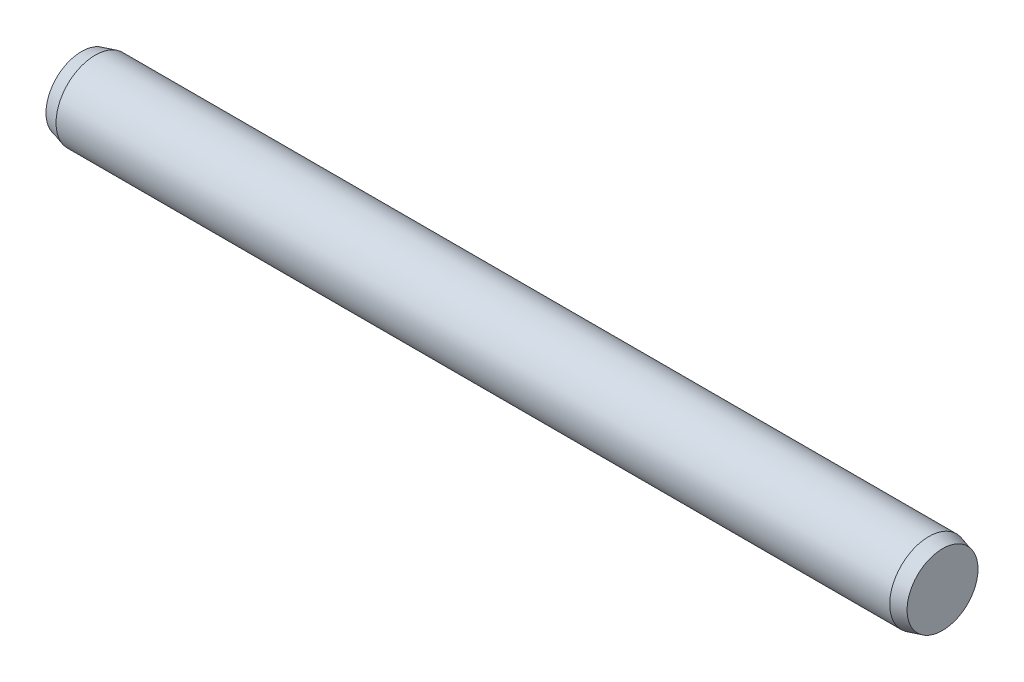
ISO-10303-21;
HEADER;
FILE_DESCRIPTION(('STEP AP214'),'2;1');
FILE_NAME('part.step','',(''),(''),'','','');
FILE_SCHEMA(('AUTOMOTIVE_DESIGN { 1 0 10303 214 1 1 1 1 }'));
ENDSEC;
DATA;
#1=APPLICATION_CONTEXT('core data for automotive mechanical design processes');
#2=APPLICATION_PROTOCOL_DEFINITION('international standard','automotive_design',2000,#1);
#3=PRODUCT_CONTEXT('',#1,'mechanical');
#4=PRODUCT('Part','Part','',(#3));
#5=PRODUCT_RELATED_PRODUCT_CATEGORY('part','',(#4));
#6=PRODUCT_DEFINITION_FORMATION('','',#4);
#7=PRODUCT_DEFINITION_CONTEXT('part definition',#1,'design');
#8=PRODUCT_DEFINITION('design','',#6,#7);
#9=PRODUCT_DEFINITION_SHAPE('','',#8);
#10=(LENGTH_UNIT() NAMED_UNIT(*) SI_UNIT(.MILLI.,.METRE.));
#11=(NAMED_UNIT(*) PLANE_ANGLE_UNIT() SI_UNIT($,.RADIAN.));
#12=(NAMED_UNIT(*) SI_UNIT($,.STERADIAN.) SOLID_ANGLE_UNIT());
#13=UNCERTAINTY_MEASURE_WITH_UNIT(LENGTH_MEASURE(1.E-05),#10,'distance_accuracy_value','');
#14=(GEOMETRIC_REPRESENTATION_CONTEXT(3) GLOBAL_UNCERTAINTY_ASSIGNED_CONTEXT((#13)) GLOBAL_UNIT_ASSIGNED_CONTEXT((#10,
#11,#12)) REPRESENTATION_CONTEXT('',''));
#15=CARTESIAN_POINT('',(0.,0.,0.));
#16=DIRECTION('',(0.,0.,1.));
#17=DIRECTION('',(1.,0.,0.));
#18=AXIS2_PLACEMENT_3D('',#15,#16,#17);
#19=CARTESIAN_POINT('',(-10.65,0.,0.));
#20=DIRECTION('',(1.,0.,0.));
#21=DIRECTION('',(0.,0.,-1.));
#22=AXIS2_PLACEMENT_3D('',#19,#20,#21);
#23=CYLINDRICAL_SURFACE('',#22,1.);
#24=CARTESIAN_POINT('',(-10.65,0.,0.));
#25=DIRECTION('',(-1.,0.,0.));
#26=DIRECTION('',(0.,0.,1.));
#27=AXIS2_PLACEMENT_3D('',#24,#25,#26);
#28=CIRCLE('',#27,1.);
#29=CARTESIAN_POINT('',(-10.65,0.,1.));
#30=VERTEX_POINT('',#29);
#31=EDGE_CURVE('E44',#30,#30,#28,.T.);
#32=ORIENTED_EDGE('',*,*,#31,.F.);
#33=EDGE_LOOP('',(#32));
#34=FACE_BOUND('',#33,.T.);
#35=CARTESIAN_POINT('',(10.65,0.,0.));
#36=DIRECTION('',(1.,0.,0.));
#37=DIRECTION('',(0.,0.,-1.));
#38=AXIS2_PLACEMENT_3D('',#35,#36,#37);
#39=CIRCLE('',#38,1.);
#40=CARTESIAN_POINT('',(10.65,0.,-1.));
#41=VERTEX_POINT('',#40);
#42=EDGE_CURVE('E10',#41,#41,#39,.T.);
#43=ORIENTED_EDGE('',*,*,#42,.F.);
#44=EDGE_LOOP('',(#43));
#45=FACE_BOUND('',#44,.T.);
#46=ADVANCED_FACE('F30',(#34,#45),#23,.T.);
#47=CARTESIAN_POINT('',(10.65,0.,0.));
#48=DIRECTION('',(-1.,0.,0.));
#49=DIRECTION('',(0.,0.,-1.));
#50=AXIS2_PLACEMENT_3D('',#47,#48,#49);
#51=CONICAL_SURFACE('',#50,1.,0.26179938779915);
#52=CARTESIAN_POINT('',(11.,0.,0.));
#53=DIRECTION('',(1.,0.,0.));
#54=DIRECTION('',(0.,0.,-1.));
#55=AXIS2_PLACEMENT_3D('',#52,#53,#54);
#56=CIRCLE('',#55,0.906217782649107);
#57=CARTESIAN_POINT('',(11.,0.,-0.906217782649107));
#58=VERTEX_POINT('',#57);
#59=EDGE_CURVE('E36',#58,#58,#56,.T.);
#60=ORIENTED_EDGE('',*,*,#59,.F.);
#61=EDGE_LOOP('',(#60));
#62=FACE_BOUND('',#61,.T.);
#63=ORIENTED_EDGE('',*,*,#42,.T.);
#64=EDGE_LOOP('',(#63));
#65=FACE_BOUND('',#64,.T.);
#66=ADVANCED_FACE('F54',(#62,#65),#51,.T.);
#67=CARTESIAN_POINT('',(11.,0.,0.));
#68=DIRECTION('',(1.,0.,0.));
#69=DIRECTION('',(0.,0.,-1.));
#70=AXIS2_PLACEMENT_3D('',#67,#68,#69);
#71=PLANE('',#70);
#72=ORIENTED_EDGE('',*,*,#59,.T.);
#73=EDGE_LOOP('',(#72));
#74=FACE_BOUND('',#73,.T.);
#75=ADVANCED_FACE('F58',(#74),#71,.T.);
#76=CARTESIAN_POINT('',(-10.65,0.,0.));
#77=DIRECTION('',(1.,0.,0.));
#78=DIRECTION('',(0.,0.,1.));
#79=AXIS2_PLACEMENT_3D('',#76,#77,#78);
#80=CONICAL_SURFACE('',#79,1.,0.26179938779915);
#81=CARTESIAN_POINT('',(-11.,0.,0.));
#82=DIRECTION('',(-1.,0.,0.));
#83=DIRECTION('',(0.,0.,1.));
#84=AXIS2_PLACEMENT_3D('',#81,#82,#83);
#85=CIRCLE('',#84,0.906217782649107);
#86=CARTESIAN_POINT('',(-11.,0.,0.906217782649107));
#87=VERTEX_POINT('',#86);
#88=EDGE_CURVE('E40',#87,#87,#85,.T.);
#89=ORIENTED_EDGE('',*,*,#88,.F.);
#90=EDGE_LOOP('',(#89));
#91=FACE_BOUND('',#90,.T.);
#92=ORIENTED_EDGE('',*,*,#31,.T.);
#93=EDGE_LOOP('',(#92));
#94=FACE_BOUND('',#93,.T.);
#95=ADVANCED_FACE('F50',(#91,#94),#80,.T.);
#96=CARTESIAN_POINT('',(-11.,0.,0.));
#97=DIRECTION('',(-1.,0.,0.));
#98=DIRECTION('',(0.,0.,1.));
#99=AXIS2_PLACEMENT_3D('',#96,#97,#98);
#100=PLANE('',#99);
#101=ORIENTED_EDGE('',*,*,#88,.T.);
#102=EDGE_LOOP('',(#101));
#103=FACE_BOUND('',#102,.T.);
#104=ADVANCED_FACE('F67',(#103),#100,.T.);
#105=CLOSED_SHELL('',(#46,#66,#75,#95,#104));
#106=MANIFOLD_SOLID_BREP('B2',#105);
#107=ADVANCED_BREP_SHAPE_REPRESENTATION('',(#18,#106),#14);
#108=SHAPE_DEFINITION_REPRESENTATION(#9,#107);
ENDSEC;
END-ISO-10303-21;
